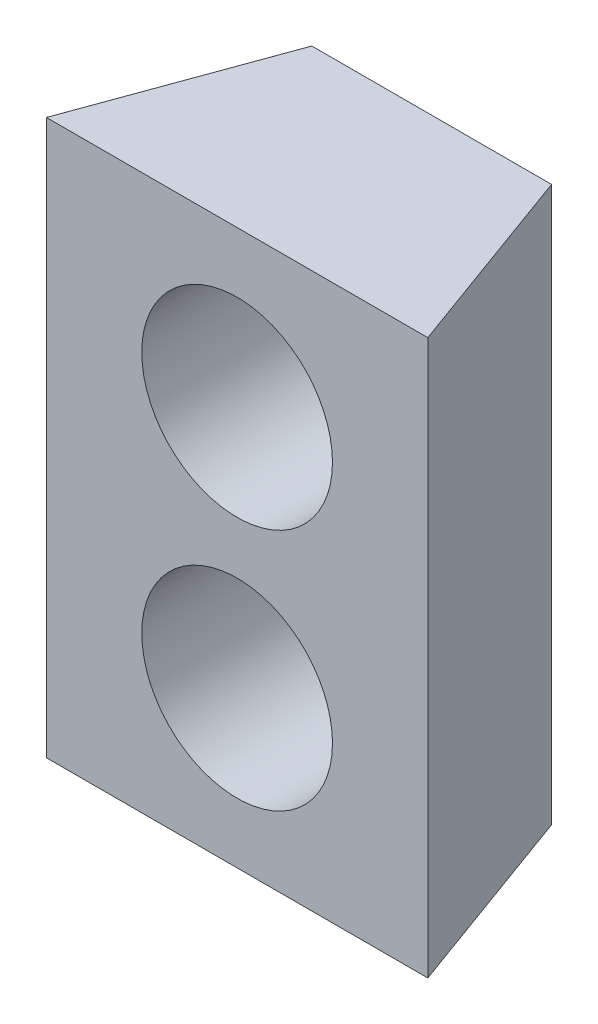
ISO-10303-21;
HEADER;
FILE_DESCRIPTION(('STEP AP214'),'2;1');
FILE_NAME('part.step','',(''),(''),'','','');
FILE_SCHEMA(('AUTOMOTIVE_DESIGN { 1 0 10303 214 1 1 1 1 }'));
ENDSEC;
DATA;
#1=APPLICATION_CONTEXT('core data for automotive mechanical design processes');
#2=APPLICATION_PROTOCOL_DEFINITION('international standard','automotive_design',2000,#1);
#3=PRODUCT_CONTEXT('',#1,'mechanical');
#4=PRODUCT('Part','Part','',(#3));
#5=PRODUCT_RELATED_PRODUCT_CATEGORY('part','',(#4));
#6=PRODUCT_DEFINITION_FORMATION('','',#4);
#7=PRODUCT_DEFINITION_CONTEXT('part definition',#1,'design');
#8=PRODUCT_DEFINITION('design','',#6,#7);
#9=PRODUCT_DEFINITION_SHAPE('','',#8);
#10=(LENGTH_UNIT() NAMED_UNIT(*) SI_UNIT(.MILLI.,.METRE.));
#11=(NAMED_UNIT(*) PLANE_ANGLE_UNIT() SI_UNIT($,.RADIAN.));
#12=(NAMED_UNIT(*) SI_UNIT($,.STERADIAN.) SOLID_ANGLE_UNIT());
#13=UNCERTAINTY_MEASURE_WITH_UNIT(LENGTH_MEASURE(1.E-05),#10,'distance_accuracy_value','');
#14=(GEOMETRIC_REPRESENTATION_CONTEXT(3) GLOBAL_UNCERTAINTY_ASSIGNED_CONTEXT((#13)) GLOBAL_UNIT_ASSIGNED_CONTEXT((#10,
#11,#12)) REPRESENTATION_CONTEXT('',''));
#15=CARTESIAN_POINT('',(0.,0.,0.));
#16=DIRECTION('',(0.,0.,1.));
#17=DIRECTION('',(1.,0.,0.));
#18=AXIS2_PLACEMENT_3D('',#15,#16,#17);
#19=CARTESIAN_POINT('',(6.223,13.0175,6.35));
#20=DIRECTION('',(0.,0.,-1.));
#21=DIRECTION('',(-1.,0.,0.));
#22=AXIS2_PLACEMENT_3D('',#19,#20,#21);
#23=CYLINDRICAL_SURFACE('',#22,3.1115);
#24=CARTESIAN_POINT('',(6.223,13.0175,6.35));
#25=DIRECTION('',(0.,0.,1.));
#26=DIRECTION('',(1.,0.,0.));
#27=AXIS2_PLACEMENT_3D('',#24,#25,#26);
#28=CIRCLE('',#27,3.1115);
#29=CARTESIAN_POINT('',(9.3345,13.0175,6.35));
#30=VERTEX_POINT('',#29);
#31=EDGE_CURVE('E85',#30,#30,#28,.T.);
#32=ORIENTED_EDGE('',*,*,#31,.T.);
#33=EDGE_LOOP('',(#32));
#34=FACE_BOUND('',#33,.T.);
#35=CARTESIAN_POINT('',(6.223,13.0175,1.27));
#36=DIRECTION('',(0.,0.,-1.));
#37=DIRECTION('',(-1.,0.,0.));
#38=AXIS2_PLACEMENT_3D('',#35,#36,#37);
#39=CIRCLE('',#38,3.1115);
#40=CARTESIAN_POINT('',(3.11149999999999,13.0175,1.27));
#41=VERTEX_POINT('',#40);
#42=EDGE_CURVE('E124',#41,#41,#39,.F.);
#43=ORIENTED_EDGE('',*,*,#42,.F.);
#44=EDGE_LOOP('',(#43));
#45=FACE_BOUND('',#44,.T.);
#46=ADVANCED_FACE('F34',(#34,#45),#23,.F.);
#47=CARTESIAN_POINT('',(6.223,5.08,6.35));
#48=DIRECTION('',(0.,0.,-1.));
#49=DIRECTION('',(-1.,0.,0.));
#50=AXIS2_PLACEMENT_3D('',#47,#48,#49);
#51=CYLINDRICAL_SURFACE('',#50,3.11149999999999);
#52=CARTESIAN_POINT('',(6.223,5.08,6.35));
#53=DIRECTION('',(0.,0.,1.));
#54=DIRECTION('',(1.,0.,0.));
#55=AXIS2_PLACEMENT_3D('',#52,#53,#54);
#56=CIRCLE('',#55,3.11149999999999);
#57=CARTESIAN_POINT('',(9.33449999999999,5.08,6.35));
#58=VERTEX_POINT('',#57);
#59=EDGE_CURVE('E96',#58,#58,#56,.T.);
#60=ORIENTED_EDGE('',*,*,#59,.T.);
#61=EDGE_LOOP('',(#60));
#62=FACE_BOUND('',#61,.T.);
#63=CARTESIAN_POINT('',(6.223,5.08,1.27));
#64=DIRECTION('',(0.,0.,-1.));
#65=DIRECTION('',(-1.,0.,0.));
#66=AXIS2_PLACEMENT_3D('',#63,#64,#65);
#67=CIRCLE('',#66,3.1115);
#68=CARTESIAN_POINT('',(3.1115,5.08,1.27));
#69=VERTEX_POINT('',#68);
#70=EDGE_CURVE('E115',#69,#69,#67,.F.);
#71=ORIENTED_EDGE('',*,*,#70,.F.);
#72=EDGE_LOOP('',(#71));
#73=FACE_BOUND('',#72,.T.);
#74=ADVANCED_FACE('F135',(#62,#73),#51,.F.);
#75=CARTESIAN_POINT('',(0.,0.,6.35));
#76=DIRECTION('',(0.,0.,-1.));
#77=DIRECTION('',(-1.,0.,0.));
#78=AXIS2_PLACEMENT_3D('',#75,#76,#77);
#79=PLANE('',#78);
#80=DIRECTION('',(0.,-1.,0.));
#81=VECTOR('',#80,1.);
#82=CARTESIAN_POINT('',(0.,0.,6.35));
#83=LINE('',#82,#81);
#84=CARTESIAN_POINT('',(0.,18.0975,6.35));
#85=VERTEX_POINT('',#84);
#86=CARTESIAN_POINT('',(0.,0.,6.35));
#87=VERTEX_POINT('',#86);
#88=EDGE_CURVE('E59',#85,#87,#83,.T.);
#89=ORIENTED_EDGE('',*,*,#88,.T.);
#90=DIRECTION('',(1.,0.,0.));
#91=VECTOR('',#90,1.);
#92=CARTESIAN_POINT('',(0.,0.,6.35));
#93=LINE('',#92,#91);
#94=CARTESIAN_POINT('',(12.446,0.,6.35));
#95=VERTEX_POINT('',#94);
#96=EDGE_CURVE('E92',#87,#95,#93,.T.);
#97=ORIENTED_EDGE('',*,*,#96,.T.);
#98=DIRECTION('',(0.,1.,0.));
#99=VECTOR('',#98,1.);
#100=CARTESIAN_POINT('',(12.446,0.,6.35));
#101=LINE('',#100,#99);
#102=CARTESIAN_POINT('',(12.446,18.0975,6.35));
#103=VERTEX_POINT('',#102);
#104=EDGE_CURVE('E43',#95,#103,#101,.T.);
#105=ORIENTED_EDGE('',*,*,#104,.T.);
#106=DIRECTION('',(-1.,0.,0.));
#107=VECTOR('',#106,1.);
#108=CARTESIAN_POINT('',(0.,18.0975,6.35));
#109=LINE('',#108,#107);
#110=EDGE_CURVE('E12',#103,#85,#109,.T.);
#111=ORIENTED_EDGE('',*,*,#110,.T.);
#112=EDGE_LOOP('',(#89,#97,#105,#111));
#113=FACE_BOUND('',#112,.T.);
#114=ORIENTED_EDGE('',*,*,#59,.F.);
#115=EDGE_LOOP('',(#114));
#116=FACE_BOUND('',#115,.T.);
#117=ORIENTED_EDGE('',*,*,#31,.F.);
#118=EDGE_LOOP('',(#117));
#119=FACE_BOUND('',#118,.T.);
#120=ADVANCED_FACE('F141',(#113,#116,#119),#79,.F.);
#121=CARTESIAN_POINT('',(0.,0.,0.));
#122=DIRECTION('',(0.,0.,-1.));
#123=DIRECTION('',(-1.,0.,0.));
#124=AXIS2_PLACEMENT_3D('',#121,#122,#123);
#125=PLANE('',#124);
#126=DIRECTION('',(0.,1.,0.));
#127=VECTOR('',#126,1.);
#128=CARTESIAN_POINT('',(2.31121098759034,0.,0.));
#129=LINE('',#128,#127);
#130=CARTESIAN_POINT('',(2.31121098759034,0.,0.));
#131=VERTEX_POINT('',#130);
#132=CARTESIAN_POINT('',(2.31121098759034,18.0975,0.));
#133=VERTEX_POINT('',#132);
#134=EDGE_CURVE('E75',#131,#133,#129,.T.);
#135=ORIENTED_EDGE('',*,*,#134,.T.);
#136=DIRECTION('',(-1.,0.,0.));
#137=VECTOR('',#136,1.);
#138=CARTESIAN_POINT('',(0.,18.0975,0.));
#139=LINE('',#138,#137);
#140=CARTESIAN_POINT('',(10.1347890124096,18.0975,0.));
#141=VERTEX_POINT('',#140);
#142=EDGE_CURVE('E38',#141,#133,#139,.T.);
#143=ORIENTED_EDGE('',*,*,#142,.F.);
#144=DIRECTION('',(0.,1.,0.));
#145=VECTOR('',#144,1.);
#146=CARTESIAN_POINT('',(10.1347890124097,0.,0.));
#147=LINE('',#146,#145);
#148=CARTESIAN_POINT('',(10.1347890124097,0.,0.));
#149=VERTEX_POINT('',#148);
#150=EDGE_CURVE('E51',#149,#141,#147,.T.);
#151=ORIENTED_EDGE('',*,*,#150,.F.);
#152=DIRECTION('',(1.,0.,0.));
#153=VECTOR('',#152,1.);
#154=CARTESIAN_POINT('',(0.,0.,0.));
#155=LINE('',#154,#153);
#156=EDGE_CURVE('E90',#131,#149,#155,.T.);
#157=ORIENTED_EDGE('',*,*,#156,.F.);
#158=EDGE_LOOP('',(#135,#143,#151,#157));
#159=FACE_BOUND('',#158,.T.);
#160=CARTESIAN_POINT('',(6.223,5.08,0.));
#161=DIRECTION('',(0.,0.,-1.));
#162=DIRECTION('',(-1.,0.,0.));
#163=AXIS2_PLACEMENT_3D('',#160,#161,#162);
#164=CIRCLE('',#163,2.8575);
#165=CARTESIAN_POINT('',(3.3655,5.08,0.));
#166=VERTEX_POINT('',#165);
#167=EDGE_CURVE('E116',#166,#166,#164,.T.);
#168=ORIENTED_EDGE('',*,*,#167,.F.);
#169=EDGE_LOOP('',(#168));
#170=FACE_BOUND('',#169,.T.);
#171=CARTESIAN_POINT('',(6.223,13.0175,0.));
#172=DIRECTION('',(0.,0.,-1.));
#173=DIRECTION('',(-1.,0.,0.));
#174=AXIS2_PLACEMENT_3D('',#171,#172,#173);
#175=CIRCLE('',#174,2.8575);
#176=CARTESIAN_POINT('',(3.36549999999999,13.0175,0.));
#177=VERTEX_POINT('',#176);
#178=EDGE_CURVE('E125',#177,#177,#175,.T.);
#179=ORIENTED_EDGE('',*,*,#178,.F.);
#180=EDGE_LOOP('',(#179));
#181=FACE_BOUND('',#180,.T.);
#182=ADVANCED_FACE('F94',(#159,#170,#181),#125,.T.);
#183=CARTESIAN_POINT('',(0.,0.,6.35));
#184=DIRECTION('',(0.,1.,0.));
#185=DIRECTION('',(-1.,0.,0.));
#186=AXIS2_PLACEMENT_3D('',#183,#184,#185);
#187=PLANE('',#186);
#188=ORIENTED_EDGE('',*,*,#96,.F.);
#189=DIRECTION('',(0.342020143325663,0.,-0.939692620785911));
#190=VECTOR('',#189,1.);
#191=CARTESIAN_POINT('',(2.31121098759034,0.,0.));
#192=LINE('',#191,#190);
#193=EDGE_CURVE('E78',#87,#131,#192,.T.);
#194=ORIENTED_EDGE('',*,*,#193,.T.);
#195=ORIENTED_EDGE('',*,*,#156,.T.);
#196=DIRECTION('',(0.342020143325663,0.,0.939692620785911));
#197=VECTOR('',#196,1.);
#198=CARTESIAN_POINT('',(10.1347890124097,0.,0.));
#199=LINE('',#198,#197);
#200=EDGE_CURVE('E107',#149,#95,#199,.T.);
#201=ORIENTED_EDGE('',*,*,#200,.T.);
#202=EDGE_LOOP('',(#188,#194,#195,#201));
#203=FACE_BOUND('',#202,.T.);
#204=ADVANCED_FACE('F36',(#203),#187,.F.);
#205=CARTESIAN_POINT('',(0.,18.0975,6.35));
#206=DIRECTION('',(0.,-1.,0.));
#207=DIRECTION('',(0.,0.,-1.));
#208=AXIS2_PLACEMENT_3D('',#205,#206,#207);
#209=PLANE('',#208);
#210=ORIENTED_EDGE('',*,*,#142,.T.);
#211=DIRECTION('',(0.342020143325663,0.,-0.939692620785911));
#212=VECTOR('',#211,1.);
#213=CARTESIAN_POINT('',(2.31121098759034,18.0975,0.));
#214=LINE('',#213,#212);
#215=EDGE_CURVE('E80',#85,#133,#214,.T.);
#216=ORIENTED_EDGE('',*,*,#215,.F.);
#217=ORIENTED_EDGE('',*,*,#110,.F.);
#218=DIRECTION('',(0.342020143325663,0.,0.939692620785911));
#219=VECTOR('',#218,1.);
#220=CARTESIAN_POINT('',(10.1347890124097,18.0975,0.));
#221=LINE('',#220,#219);
#222=EDGE_CURVE('E108',#141,#103,#221,.T.);
#223=ORIENTED_EDGE('',*,*,#222,.F.);
#224=EDGE_LOOP('',(#210,#216,#217,#223));
#225=FACE_BOUND('',#224,.T.);
#226=ADVANCED_FACE('F152',(#225),#209,.F.);
#227=CARTESIAN_POINT('',(10.1347890124097,0.,0.));
#228=DIRECTION('',(-0.93969262078591,0.,0.342020143325663));
#229=DIRECTION('',(0.342020143325663,0.,0.939692620785911));
#230=AXIS2_PLACEMENT_3D('',#227,#228,#229);
#231=PLANE('',#230);
#232=ORIENTED_EDGE('',*,*,#222,.T.);
#233=ORIENTED_EDGE('',*,*,#104,.F.);
#234=ORIENTED_EDGE('',*,*,#200,.F.);
#235=ORIENTED_EDGE('',*,*,#150,.T.);
#236=EDGE_LOOP('',(#232,#233,#234,#235));
#237=FACE_BOUND('',#236,.T.);
#238=ADVANCED_FACE('F145',(#237),#231,.F.);
#239=CARTESIAN_POINT('',(2.31121098759034,0.,0.));
#240=DIRECTION('',(0.93969262078591,0.,0.342020143325663));
#241=DIRECTION('',(0.342020143325663,0.,-0.939692620785911));
#242=AXIS2_PLACEMENT_3D('',#239,#240,#241);
#243=PLANE('',#242);
#244=ORIENTED_EDGE('',*,*,#215,.T.);
#245=ORIENTED_EDGE('',*,*,#134,.F.);
#246=ORIENTED_EDGE('',*,*,#193,.F.);
#247=ORIENTED_EDGE('',*,*,#88,.F.);
#248=EDGE_LOOP('',(#244,#245,#246,#247));
#249=FACE_BOUND('',#248,.T.);
#250=ADVANCED_FACE('F77',(#249),#243,.F.);
#251=CARTESIAN_POINT('',(6.223,5.08,15.1506509986478));
#252=DIRECTION('',(0.,0.,-1.));
#253=DIRECTION('',(-1.,0.,0.));
#254=AXIS2_PLACEMENT_3D('',#251,#252,#253);
#255=CYLINDRICAL_SURFACE('',#254,2.8575);
#256=CARTESIAN_POINT('',(6.223,5.08,1.27));
#257=DIRECTION('',(0.,0.,-1.));
#258=DIRECTION('',(-1.,0.,0.));
#259=AXIS2_PLACEMENT_3D('',#256,#257,#258);
#260=CIRCLE('',#259,2.8575);
#261=CARTESIAN_POINT('',(3.3655,5.08,1.27));
#262=VERTEX_POINT('',#261);
#263=EDGE_CURVE('E110',#262,#262,#260,.F.);
#264=ORIENTED_EDGE('',*,*,#263,.T.);
#265=EDGE_LOOP('',(#264));
#266=FACE_BOUND('',#265,.T.);
#267=ORIENTED_EDGE('',*,*,#167,.T.);
#268=EDGE_LOOP('',(#267));
#269=FACE_BOUND('',#268,.T.);
#270=ADVANCED_FACE('F171',(#266,#269),#255,.F.);
#271=CARTESIAN_POINT('',(0.,0.,1.27));
#272=DIRECTION('',(0.,0.,-1.));
#273=DIRECTION('',(-1.,0.,0.));
#274=AXIS2_PLACEMENT_3D('',#271,#272,#273);
#275=PLANE('',#274);
#276=ORIENTED_EDGE('',*,*,#70,.T.);
#277=EDGE_LOOP('',(#276));
#278=FACE_BOUND('',#277,.T.);
#279=ORIENTED_EDGE('',*,*,#263,.F.);
#280=EDGE_LOOP('',(#279));
#281=FACE_BOUND('',#280,.T.);
#282=ADVANCED_FACE('F167',(#278,#281),#275,.F.);
#283=CARTESIAN_POINT('',(6.223,13.0175,15.1506509986478));
#284=DIRECTION('',(0.,0.,-1.));
#285=DIRECTION('',(-1.,0.,0.));
#286=AXIS2_PLACEMENT_3D('',#283,#284,#285);
#287=CYLINDRICAL_SURFACE('',#286,2.8575);
#288=CARTESIAN_POINT('',(6.223,13.0175,1.27));
#289=DIRECTION('',(0.,0.,-1.));
#290=DIRECTION('',(-1.,0.,0.));
#291=AXIS2_PLACEMENT_3D('',#288,#289,#290);
#292=CIRCLE('',#291,2.8575);
#293=CARTESIAN_POINT('',(3.36549999999999,13.0175,1.27));
#294=VERTEX_POINT('',#293);
#295=EDGE_CURVE('E119',#294,#294,#292,.F.);
#296=ORIENTED_EDGE('',*,*,#295,.T.);
#297=EDGE_LOOP('',(#296));
#298=FACE_BOUND('',#297,.T.);
#299=ORIENTED_EDGE('',*,*,#178,.T.);
#300=EDGE_LOOP('',(#299));
#301=FACE_BOUND('',#300,.T.);
#302=ADVANCED_FACE('F170',(#298,#301),#287,.F.);
#303=CARTESIAN_POINT('',(0.,0.,1.27));
#304=DIRECTION('',(0.,0.,-1.));
#305=DIRECTION('',(-1.,0.,0.));
#306=AXIS2_PLACEMENT_3D('',#303,#304,#305);
#307=PLANE('',#306);
#308=ORIENTED_EDGE('',*,*,#42,.T.);
#309=EDGE_LOOP('',(#308));
#310=FACE_BOUND('',#309,.T.);
#311=ORIENTED_EDGE('',*,*,#295,.F.);
#312=EDGE_LOOP('',(#311));
#313=FACE_BOUND('',#312,.T.);
#314=ADVANCED_FACE('F131',(#310,#313),#307,.F.);
#315=CLOSED_SHELL('',(#46,#74,#120,#182,#204,#226,#238,#250,#270,#282,#302,#314));
#316=MANIFOLD_SOLID_BREP('B2',#315);
#317=ADVANCED_BREP_SHAPE_REPRESENTATION('',(#18,#316),#14);
#318=SHAPE_DEFINITION_REPRESENTATION(#9,#317);
ENDSEC;
END-ISO-10303-21;
